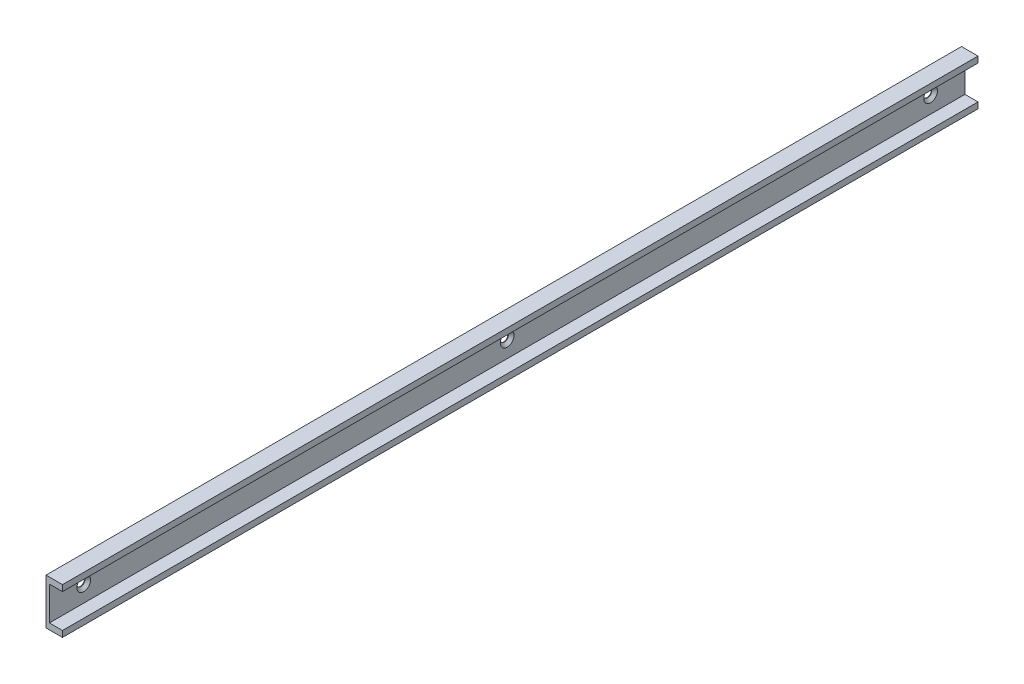
ISO-10303-21;
HEADER;
FILE_DESCRIPTION(('STEP AP214'),'2;1');
FILE_NAME('part.step','',(''),(''),'','','');
FILE_SCHEMA(('AUTOMOTIVE_DESIGN { 1 0 10303 214 1 1 1 1 }'));
ENDSEC;
DATA;
#1=APPLICATION_CONTEXT('core data for automotive mechanical design processes');
#2=APPLICATION_PROTOCOL_DEFINITION('international standard','automotive_design',2000,#1);
#3=PRODUCT_CONTEXT('',#1,'mechanical');
#4=PRODUCT('Part','Part','',(#3));
#5=PRODUCT_RELATED_PRODUCT_CATEGORY('part','',(#4));
#6=PRODUCT_DEFINITION_FORMATION('','',#4);
#7=PRODUCT_DEFINITION_CONTEXT('part definition',#1,'design');
#8=PRODUCT_DEFINITION('design','',#6,#7);
#9=PRODUCT_DEFINITION_SHAPE('','',#8);
#10=(LENGTH_UNIT() NAMED_UNIT(*) SI_UNIT(.MILLI.,.METRE.));
#11=(NAMED_UNIT(*) PLANE_ANGLE_UNIT() SI_UNIT($,.RADIAN.));
#12=(NAMED_UNIT(*) SI_UNIT($,.STERADIAN.) SOLID_ANGLE_UNIT());
#13=UNCERTAINTY_MEASURE_WITH_UNIT(LENGTH_MEASURE(1.E-05),#10,'distance_accuracy_value','');
#14=(GEOMETRIC_REPRESENTATION_CONTEXT(3) GLOBAL_UNCERTAINTY_ASSIGNED_CONTEXT((#13)) GLOBAL_UNIT_ASSIGNED_CONTEXT((#10,
#11,#12)) REPRESENTATION_CONTEXT('',''));
#15=CARTESIAN_POINT('',(0.,0.,0.));
#16=DIRECTION('',(0.,0.,1.));
#17=DIRECTION('',(1.,0.,0.));
#18=AXIS2_PLACEMENT_3D('',#15,#16,#17);
#19=CARTESIAN_POINT('',(3.6,-10.,200.));
#20=DIRECTION('',(-1.,0.,0.));
#21=DIRECTION('',(0.,0.,1.));
#22=AXIS2_PLACEMENT_3D('',#19,#20,#21);
#23=PLANE('',#22);
#24=DIRECTION('',(0.,1.,0.));
#25=VECTOR('',#24,1.);
#26=CARTESIAN_POINT('',(3.6,-10.,-200.));
#27=LINE('',#26,#25);
#28=CARTESIAN_POINT('',(3.6,-10.,-200.));
#29=VERTEX_POINT('',#28);
#30=CARTESIAN_POINT('',(3.6,-7.35,-200.));
#31=VERTEX_POINT('',#30);
#32=EDGE_CURVE('E129',#29,#31,#27,.T.);
#33=ORIENTED_EDGE('',*,*,#32,.T.);
#34=DIRECTION('',(0.,0.,1.));
#35=VECTOR('',#34,1.);
#36=CARTESIAN_POINT('',(3.6,-7.35,-200.));
#37=LINE('',#36,#35);
#38=CARTESIAN_POINT('',(3.6,-7.35,200.));
#39=VERTEX_POINT('',#38);
#40=EDGE_CURVE('E130',#31,#39,#37,.T.);
#41=ORIENTED_EDGE('',*,*,#40,.T.);
#42=DIRECTION('',(0.,1.,0.));
#43=VECTOR('',#42,1.);
#44=CARTESIAN_POINT('',(3.6,-10.,200.));
#45=LINE('',#44,#43);
#46=CARTESIAN_POINT('',(3.6,-10.,200.));
#47=VERTEX_POINT('',#46);
#48=EDGE_CURVE('E158',#47,#39,#45,.T.);
#49=ORIENTED_EDGE('',*,*,#48,.F.);
#50=DIRECTION('',(0.,0.,-1.));
#51=VECTOR('',#50,1.);
#52=CARTESIAN_POINT('',(3.6,-10.,200.));
#53=LINE('',#52,#51);
#54=EDGE_CURVE('E143',#47,#29,#53,.T.);
#55=ORIENTED_EDGE('',*,*,#54,.T.);
#56=EDGE_LOOP('',(#33,#41,#49,#55));
#57=FACE_BOUND('',#56,.T.);
#58=ADVANCED_FACE('F35',(#57),#23,.F.);
#59=CARTESIAN_POINT('',(3.6,7.35,200.));
#60=VERTEX_POINT('',#59);
#61=CARTESIAN_POINT('',(3.6,10.,200.));
#62=VERTEX_POINT('',#61);
#63=EDGE_CURVE('E87',#60,#62,#45,.T.);
#64=ORIENTED_EDGE('',*,*,#63,.F.);
#65=DIRECTION('',(0.,0.,1.));
#66=VECTOR('',#65,1.);
#67=CARTESIAN_POINT('',(3.6,7.35,-200.));
#68=LINE('',#67,#66);
#69=CARTESIAN_POINT('',(3.6,7.35,-200.));
#70=VERTEX_POINT('',#69);
#71=EDGE_CURVE('E113',#70,#60,#68,.T.);
#72=ORIENTED_EDGE('',*,*,#71,.F.);
#73=CARTESIAN_POINT('',(3.6,10.,-200.));
#74=VERTEX_POINT('',#73);
#75=EDGE_CURVE('E121',#70,#74,#27,.T.);
#76=ORIENTED_EDGE('',*,*,#75,.T.);
#77=DIRECTION('',(0.,0.,-1.));
#78=VECTOR('',#77,1.);
#79=CARTESIAN_POINT('',(3.6,10.,200.));
#80=LINE('',#79,#78);
#81=EDGE_CURVE('E11',#62,#74,#80,.T.);
#82=ORIENTED_EDGE('',*,*,#81,.F.);
#83=EDGE_LOOP('',(#64,#72,#76,#82));
#84=FACE_BOUND('',#83,.T.);
#85=ADVANCED_FACE('F37',(#84),#23,.F.);
#86=CARTESIAN_POINT('',(-3.6,10.,200.));
#87=DIRECTION('',(0.,-1.,0.));
#88=DIRECTION('',(0.,0.,-1.));
#89=AXIS2_PLACEMENT_3D('',#86,#87,#88);
#90=PLANE('',#89);
#91=DIRECTION('',(-1.,0.,0.));
#92=VECTOR('',#91,1.);
#93=CARTESIAN_POINT('',(-3.6,10.,-200.));
#94=LINE('',#93,#92);
#95=CARTESIAN_POINT('',(-3.6,10.,-200.));
#96=VERTEX_POINT('',#95);
#97=EDGE_CURVE('E128',#74,#96,#94,.T.);
#98=ORIENTED_EDGE('',*,*,#97,.T.);
#99=DIRECTION('',(0.,0.,-1.));
#100=VECTOR('',#99,1.);
#101=CARTESIAN_POINT('',(-3.6,10.,200.));
#102=LINE('',#101,#100);
#103=CARTESIAN_POINT('',(-3.6,10.,200.));
#104=VERTEX_POINT('',#103);
#105=EDGE_CURVE('E43',#104,#96,#102,.T.);
#106=ORIENTED_EDGE('',*,*,#105,.F.);
#107=DIRECTION('',(-1.,0.,0.));
#108=VECTOR('',#107,1.);
#109=CARTESIAN_POINT('',(-3.6,10.,200.));
#110=LINE('',#109,#108);
#111=EDGE_CURVE('E160',#62,#104,#110,.T.);
#112=ORIENTED_EDGE('',*,*,#111,.F.);
#113=ORIENTED_EDGE('',*,*,#81,.T.);
#114=EDGE_LOOP('',(#98,#106,#112,#113));
#115=FACE_BOUND('',#114,.T.);
#116=ADVANCED_FACE('F227',(#115),#90,.F.);
#117=CARTESIAN_POINT('',(-3.6,-10.,200.));
#118=DIRECTION('',(1.,0.,0.));
#119=DIRECTION('',(0.,0.,-1.));
#120=AXIS2_PLACEMENT_3D('',#117,#118,#119);
#121=PLANE('',#120);
#122=CARTESIAN_POINT('',(-3.6,0.,-185.));
#123=DIRECTION('',(1.,0.,0.));
#124=DIRECTION('',(0.,0.,-1.));
#125=AXIS2_PLACEMENT_3D('',#122,#123,#124);
#126=CIRCLE('',#125,1.75);
#127=CARTESIAN_POINT('',(-3.6,0.,-186.75));
#128=VERTEX_POINT('',#127);
#129=EDGE_CURVE('E196',#128,#128,#126,.T.);
#130=ORIENTED_EDGE('',*,*,#129,.T.);
#131=EDGE_LOOP('',(#130));
#132=FACE_BOUND('',#131,.T.);
#133=CARTESIAN_POINT('',(-3.6,0.,185.));
#134=DIRECTION('',(1.,0.,0.));
#135=DIRECTION('',(0.,0.,-1.));
#136=AXIS2_PLACEMENT_3D('',#133,#134,#135);
#137=CIRCLE('',#136,1.75);
#138=CARTESIAN_POINT('',(-3.6,0.,183.25));
#139=VERTEX_POINT('',#138);
#140=EDGE_CURVE('E188',#139,#139,#137,.T.);
#141=ORIENTED_EDGE('',*,*,#140,.T.);
#142=EDGE_LOOP('',(#141));
#143=FACE_BOUND('',#142,.T.);
#144=CARTESIAN_POINT('',(-3.6,0.,0.));
#145=DIRECTION('',(1.,0.,0.));
#146=DIRECTION('',(0.,0.,-1.));
#147=AXIS2_PLACEMENT_3D('',#144,#145,#146);
#148=CIRCLE('',#147,1.75);
#149=CARTESIAN_POINT('',(-3.6,0.,-1.75));
#150=VERTEX_POINT('',#149);
#151=EDGE_CURVE('E172',#150,#150,#148,.T.);
#152=ORIENTED_EDGE('',*,*,#151,.T.);
#153=EDGE_LOOP('',(#152));
#154=FACE_BOUND('',#153,.T.);
#155=DIRECTION('',(0.,-1.,0.));
#156=VECTOR('',#155,1.);
#157=CARTESIAN_POINT('',(-3.6,-10.,-200.));
#158=LINE('',#157,#156);
#159=CARTESIAN_POINT('',(-3.6,-10.,-200.));
#160=VERTEX_POINT('',#159);
#161=EDGE_CURVE('E140',#96,#160,#158,.T.);
#162=ORIENTED_EDGE('',*,*,#161,.T.);
#163=DIRECTION('',(0.,0.,-1.));
#164=VECTOR('',#163,1.);
#165=CARTESIAN_POINT('',(-3.6,-10.,200.));
#166=LINE('',#165,#164);
#167=CARTESIAN_POINT('',(-3.6,-10.,200.));
#168=VERTEX_POINT('',#167);
#169=EDGE_CURVE('E145',#168,#160,#166,.T.);
#170=ORIENTED_EDGE('',*,*,#169,.F.);
#171=DIRECTION('',(0.,-1.,0.));
#172=VECTOR('',#171,1.);
#173=CARTESIAN_POINT('',(-3.6,-10.,200.));
#174=LINE('',#173,#172);
#175=EDGE_CURVE('E152',#104,#168,#174,.T.);
#176=ORIENTED_EDGE('',*,*,#175,.F.);
#177=ORIENTED_EDGE('',*,*,#105,.T.);
#178=EDGE_LOOP('',(#162,#170,#176,#177));
#179=FACE_BOUND('',#178,.T.);
#180=ADVANCED_FACE('F150',(#132,#143,#154,#179),#121,.F.);
#181=CARTESIAN_POINT('',(-3.6,-10.,200.));
#182=DIRECTION('',(0.,1.,0.));
#183=DIRECTION('',(0.,0.,1.));
#184=AXIS2_PLACEMENT_3D('',#181,#182,#183);
#185=PLANE('',#184);
#186=DIRECTION('',(1.,0.,0.));
#187=VECTOR('',#186,1.);
#188=CARTESIAN_POINT('',(-3.6,-10.,-200.));
#189=LINE('',#188,#187);
#190=EDGE_CURVE('E80',#160,#29,#189,.T.);
#191=ORIENTED_EDGE('',*,*,#190,.T.);
#192=ORIENTED_EDGE('',*,*,#54,.F.);
#193=DIRECTION('',(1.,0.,0.));
#194=VECTOR('',#193,1.);
#195=CARTESIAN_POINT('',(-3.6,-10.,200.));
#196=LINE('',#195,#194);
#197=EDGE_CURVE('E59',#168,#47,#196,.T.);
#198=ORIENTED_EDGE('',*,*,#197,.F.);
#199=ORIENTED_EDGE('',*,*,#169,.T.);
#200=EDGE_LOOP('',(#191,#192,#198,#199));
#201=FACE_BOUND('',#200,.T.);
#202=ADVANCED_FACE('F159',(#201),#185,.F.);
#203=CARTESIAN_POINT('',(0.,0.,200.));
#204=DIRECTION('',(0.,0.,-1.));
#205=DIRECTION('',(-1.,0.,0.));
#206=AXIS2_PLACEMENT_3D('',#203,#204,#205);
#207=PLANE('',#206);
#208=ORIENTED_EDGE('',*,*,#48,.T.);
#209=DIRECTION('',(1.,0.,0.));
#210=VECTOR('',#209,1.);
#211=CARTESIAN_POINT('',(-2.1,-7.35,200.));
#212=LINE('',#211,#210);
#213=CARTESIAN_POINT('',(-2.1,-7.35,200.));
#214=VERTEX_POINT('',#213);
#215=EDGE_CURVE('E117',#214,#39,#212,.T.);
#216=ORIENTED_EDGE('',*,*,#215,.F.);
#217=DIRECTION('',(0.,-1.,0.));
#218=VECTOR('',#217,1.);
#219=CARTESIAN_POINT('',(-2.1,7.35,200.));
#220=LINE('',#219,#218);
#221=CARTESIAN_POINT('',(-2.1,7.35,200.));
#222=VERTEX_POINT('',#221);
#223=EDGE_CURVE('E167',#222,#214,#220,.T.);
#224=ORIENTED_EDGE('',*,*,#223,.F.);
#225=DIRECTION('',(-1.,0.,0.));
#226=VECTOR('',#225,1.);
#227=CARTESIAN_POINT('',(3.6,7.35,200.));
#228=LINE('',#227,#226);
#229=EDGE_CURVE('E170',#60,#222,#228,.T.);
#230=ORIENTED_EDGE('',*,*,#229,.F.);
#231=ORIENTED_EDGE('',*,*,#63,.T.);
#232=ORIENTED_EDGE('',*,*,#111,.T.);
#233=ORIENTED_EDGE('',*,*,#175,.T.);
#234=ORIENTED_EDGE('',*,*,#197,.T.);
#235=EDGE_LOOP('',(#208,#216,#224,#230,#231,#232,#233,#234));
#236=FACE_BOUND('',#235,.T.);
#237=ADVANCED_FACE('F214',(#236),#207,.F.);
#238=CARTESIAN_POINT('',(0.,0.,-200.));
#239=DIRECTION('',(0.,0.,-1.));
#240=DIRECTION('',(-1.,0.,0.));
#241=AXIS2_PLACEMENT_3D('',#238,#239,#240);
#242=PLANE('',#241);
#243=DIRECTION('',(1.,0.,0.));
#244=VECTOR('',#243,1.);
#245=CARTESIAN_POINT('',(-2.1,-7.35,-200.));
#246=LINE('',#245,#244);
#247=CARTESIAN_POINT('',(-2.1,-7.35,-200.));
#248=VERTEX_POINT('',#247);
#249=EDGE_CURVE('E123',#248,#31,#246,.T.);
#250=ORIENTED_EDGE('',*,*,#249,.T.);
#251=ORIENTED_EDGE('',*,*,#32,.F.);
#252=ORIENTED_EDGE('',*,*,#190,.F.);
#253=ORIENTED_EDGE('',*,*,#161,.F.);
#254=ORIENTED_EDGE('',*,*,#97,.F.);
#255=ORIENTED_EDGE('',*,*,#75,.F.);
#256=DIRECTION('',(-1.,0.,0.));
#257=VECTOR('',#256,1.);
#258=CARTESIAN_POINT('',(3.6,7.35,-200.));
#259=LINE('',#258,#257);
#260=CARTESIAN_POINT('',(-2.1,7.35,-200.));
#261=VERTEX_POINT('',#260);
#262=EDGE_CURVE('E109',#70,#261,#259,.T.);
#263=ORIENTED_EDGE('',*,*,#262,.T.);
#264=DIRECTION('',(0.,-1.,0.));
#265=VECTOR('',#264,1.);
#266=CARTESIAN_POINT('',(-2.1,7.35,-200.));
#267=LINE('',#266,#265);
#268=EDGE_CURVE('E50',#261,#248,#267,.T.);
#269=ORIENTED_EDGE('',*,*,#268,.T.);
#270=EDGE_LOOP('',(#250,#251,#252,#253,#254,#255,#263,#269));
#271=FACE_BOUND('',#270,.T.);
#272=ADVANCED_FACE('F126',(#271),#242,.T.);
#273=CARTESIAN_POINT('',(-2.1,-7.35,-200.));
#274=DIRECTION('',(0.,-1.,0.));
#275=DIRECTION('',(0.,0.,-1.));
#276=AXIS2_PLACEMENT_3D('',#273,#274,#275);
#277=PLANE('',#276);
#278=ORIENTED_EDGE('',*,*,#215,.T.);
#279=ORIENTED_EDGE('',*,*,#40,.F.);
#280=ORIENTED_EDGE('',*,*,#249,.F.);
#281=DIRECTION('',(0.,0.,1.));
#282=VECTOR('',#281,1.);
#283=CARTESIAN_POINT('',(-2.1,-7.35,-200.));
#284=LINE('',#283,#282);
#285=EDGE_CURVE('E134',#248,#214,#284,.T.);
#286=ORIENTED_EDGE('',*,*,#285,.T.);
#287=EDGE_LOOP('',(#278,#279,#280,#286));
#288=FACE_BOUND('',#287,.T.);
#289=ADVANCED_FACE('F207',(#288),#277,.F.);
#290=CARTESIAN_POINT('',(-2.1,7.35,-200.));
#291=DIRECTION('',(-1.,0.,0.));
#292=DIRECTION('',(0.,0.,1.));
#293=AXIS2_PLACEMENT_3D('',#290,#291,#292);
#294=PLANE('',#293);
#295=CARTESIAN_POINT('',(-2.1,0.,-185.));
#296=DIRECTION('',(1.,0.,0.));
#297=DIRECTION('',(0.,0.,-1.));
#298=AXIS2_PLACEMENT_3D('',#295,#296,#297);
#299=CIRCLE('',#298,3.);
#300=CARTESIAN_POINT('',(-2.1,0.,-188.));
#301=VERTEX_POINT('',#300);
#302=EDGE_CURVE('E187',#301,#301,#299,.T.);
#303=ORIENTED_EDGE('',*,*,#302,.F.);
#304=EDGE_LOOP('',(#303));
#305=FACE_BOUND('',#304,.T.);
#306=CARTESIAN_POINT('',(-2.1,0.,185.));
#307=DIRECTION('',(1.,0.,0.));
#308=DIRECTION('',(0.,0.,-1.));
#309=AXIS2_PLACEMENT_3D('',#306,#307,#308);
#310=CIRCLE('',#309,3.);
#311=CARTESIAN_POINT('',(-2.1,0.,182.));
#312=VERTEX_POINT('',#311);
#313=EDGE_CURVE('E191',#312,#312,#310,.T.);
#314=ORIENTED_EDGE('',*,*,#313,.F.);
#315=EDGE_LOOP('',(#314));
#316=FACE_BOUND('',#315,.T.);
#317=CARTESIAN_POINT('',(-2.1,0.,0.));
#318=DIRECTION('',(1.,0.,0.));
#319=DIRECTION('',(0.,0.,-1.));
#320=AXIS2_PLACEMENT_3D('',#317,#318,#319);
#321=CIRCLE('',#320,3.);
#322=CARTESIAN_POINT('',(-2.1,0.,-3.));
#323=VERTEX_POINT('',#322);
#324=EDGE_CURVE('E180',#323,#323,#321,.T.);
#325=ORIENTED_EDGE('',*,*,#324,.F.);
#326=EDGE_LOOP('',(#325));
#327=FACE_BOUND('',#326,.T.);
#328=ORIENTED_EDGE('',*,*,#223,.T.);
#329=ORIENTED_EDGE('',*,*,#285,.F.);
#330=ORIENTED_EDGE('',*,*,#268,.F.);
#331=DIRECTION('',(0.,0.,1.));
#332=VECTOR('',#331,1.);
#333=CARTESIAN_POINT('',(-2.1,7.35,-200.));
#334=LINE('',#333,#332);
#335=EDGE_CURVE('E114',#261,#222,#334,.T.);
#336=ORIENTED_EDGE('',*,*,#335,.T.);
#337=EDGE_LOOP('',(#328,#329,#330,#336));
#338=FACE_BOUND('',#337,.T.);
#339=ADVANCED_FACE('F204',(#305,#316,#327,#338),#294,.F.);
#340=CARTESIAN_POINT('',(3.6,7.35,-200.));
#341=DIRECTION('',(0.,1.,0.));
#342=DIRECTION('',(0.,0.,1.));
#343=AXIS2_PLACEMENT_3D('',#340,#341,#342);
#344=PLANE('',#343);
#345=ORIENTED_EDGE('',*,*,#229,.T.);
#346=ORIENTED_EDGE('',*,*,#335,.F.);
#347=ORIENTED_EDGE('',*,*,#262,.F.);
#348=ORIENTED_EDGE('',*,*,#71,.T.);
#349=EDGE_LOOP('',(#345,#346,#347,#348));
#350=FACE_BOUND('',#349,.T.);
#351=ADVANCED_FACE('F112',(#350),#344,.F.);
#352=CARTESIAN_POINT('',(-2.1,0.,0.));
#353=DIRECTION('',(1.,0.,0.));
#354=DIRECTION('',(0.,0.,-1.));
#355=AXIS2_PLACEMENT_3D('',#352,#353,#354);
#356=CYLINDRICAL_SURFACE('',#355,1.75);
#357=ORIENTED_EDGE('',*,*,#151,.F.);
#358=EDGE_LOOP('',(#357));
#359=FACE_BOUND('',#358,.T.);
#360=CARTESIAN_POINT('',(-3.34999999999999,0.,0.));
#361=DIRECTION('',(1.,0.,0.));
#362=DIRECTION('',(0.,0.,-1.));
#363=AXIS2_PLACEMENT_3D('',#360,#361,#362);
#364=CIRCLE('',#363,1.75);
#365=CARTESIAN_POINT('',(-3.34999999999999,0.,-1.75));
#366=VERTEX_POINT('',#365);
#367=EDGE_CURVE('E177',#366,#366,#364,.T.);
#368=ORIENTED_EDGE('',*,*,#367,.T.);
#369=EDGE_LOOP('',(#368));
#370=FACE_BOUND('',#369,.T.);
#371=ADVANCED_FACE('F242',(#359,#370),#356,.F.);
#372=CARTESIAN_POINT('',(-2.1,0.,0.));
#373=DIRECTION('',(1.,0.,0.));
#374=DIRECTION('',(0.,0.,-1.));
#375=AXIS2_PLACEMENT_3D('',#372,#373,#374);
#376=CONICAL_SURFACE('',#375,3.,0.785398163397454);
#377=ORIENTED_EDGE('',*,*,#367,.F.);
#378=EDGE_LOOP('',(#377));
#379=FACE_BOUND('',#378,.T.);
#380=ORIENTED_EDGE('',*,*,#324,.T.);
#381=EDGE_LOOP('',(#380));
#382=FACE_BOUND('',#381,.T.);
#383=ADVANCED_FACE('F246',(#379,#382),#376,.F.);
#384=CARTESIAN_POINT('',(-2.1,0.,185.));
#385=DIRECTION('',(1.,0.,0.));
#386=DIRECTION('',(0.,0.,-1.));
#387=AXIS2_PLACEMENT_3D('',#384,#385,#386);
#388=CYLINDRICAL_SURFACE('',#387,1.75);
#389=ORIENTED_EDGE('',*,*,#140,.F.);
#390=EDGE_LOOP('',(#389));
#391=FACE_BOUND('',#390,.T.);
#392=CARTESIAN_POINT('',(-3.34999999999999,0.,185.));
#393=DIRECTION('',(1.,0.,0.));
#394=DIRECTION('',(0.,0.,-1.));
#395=AXIS2_PLACEMENT_3D('',#392,#393,#394);
#396=CIRCLE('',#395,1.75);
#397=CARTESIAN_POINT('',(-3.34999999999999,0.,183.25));
#398=VERTEX_POINT('',#397);
#399=EDGE_CURVE('E184',#398,#398,#396,.T.);
#400=ORIENTED_EDGE('',*,*,#399,.T.);
#401=EDGE_LOOP('',(#400));
#402=FACE_BOUND('',#401,.T.);
#403=ADVANCED_FACE('F251',(#391,#402),#388,.F.);
#404=CARTESIAN_POINT('',(-2.1,0.,185.));
#405=DIRECTION('',(1.,0.,0.));
#406=DIRECTION('',(0.,0.,-1.));
#407=AXIS2_PLACEMENT_3D('',#404,#405,#406);
#408=CONICAL_SURFACE('',#407,3.,0.785398163397454);
#409=ORIENTED_EDGE('',*,*,#399,.F.);
#410=EDGE_LOOP('',(#409));
#411=FACE_BOUND('',#410,.T.);
#412=ORIENTED_EDGE('',*,*,#313,.T.);
#413=EDGE_LOOP('',(#412));
#414=FACE_BOUND('',#413,.T.);
#415=ADVANCED_FACE('F259',(#411,#414),#408,.F.);
#416=CARTESIAN_POINT('',(-2.1,0.,-185.));
#417=DIRECTION('',(1.,0.,0.));
#418=DIRECTION('',(0.,0.,-1.));
#419=AXIS2_PLACEMENT_3D('',#416,#417,#418);
#420=CYLINDRICAL_SURFACE('',#419,1.75);
#421=ORIENTED_EDGE('',*,*,#129,.F.);
#422=EDGE_LOOP('',(#421));
#423=FACE_BOUND('',#422,.T.);
#424=CARTESIAN_POINT('',(-3.34999999999999,0.,-185.));
#425=DIRECTION('',(1.,0.,0.));
#426=DIRECTION('',(0.,0.,-1.));
#427=AXIS2_PLACEMENT_3D('',#424,#425,#426);
#428=CIRCLE('',#427,1.75);
#429=CARTESIAN_POINT('',(-3.34999999999999,0.,-186.75));
#430=VERTEX_POINT('',#429);
#431=EDGE_CURVE('E183',#430,#430,#428,.T.);
#432=ORIENTED_EDGE('',*,*,#431,.T.);
#433=EDGE_LOOP('',(#432));
#434=FACE_BOUND('',#433,.T.);
#435=ADVANCED_FACE('F263',(#423,#434),#420,.F.);
#436=CARTESIAN_POINT('',(-2.1,0.,-185.));
#437=DIRECTION('',(1.,0.,0.));
#438=DIRECTION('',(0.,0.,-1.));
#439=AXIS2_PLACEMENT_3D('',#436,#437,#438);
#440=CONICAL_SURFACE('',#439,3.,0.785398163397454);
#441=ORIENTED_EDGE('',*,*,#431,.F.);
#442=EDGE_LOOP('',(#441));
#443=FACE_BOUND('',#442,.T.);
#444=ORIENTED_EDGE('',*,*,#302,.T.);
#445=EDGE_LOOP('',(#444));
#446=FACE_BOUND('',#445,.T.);
#447=ADVANCED_FACE('F202',(#443,#446),#440,.F.);
#448=CLOSED_SHELL('',(#58,#85,#116,#180,#202,#237,#272,#289,#339,#351,#371,#383,#403,#415,#435,#447));
#449=MANIFOLD_SOLID_BREP('B2',#448);
#450=ADVANCED_BREP_SHAPE_REPRESENTATION('',(#18,#449),#14);
#451=SHAPE_DEFINITION_REPRESENTATION(#9,#450);
ENDSEC;
END-ISO-10303-21;
